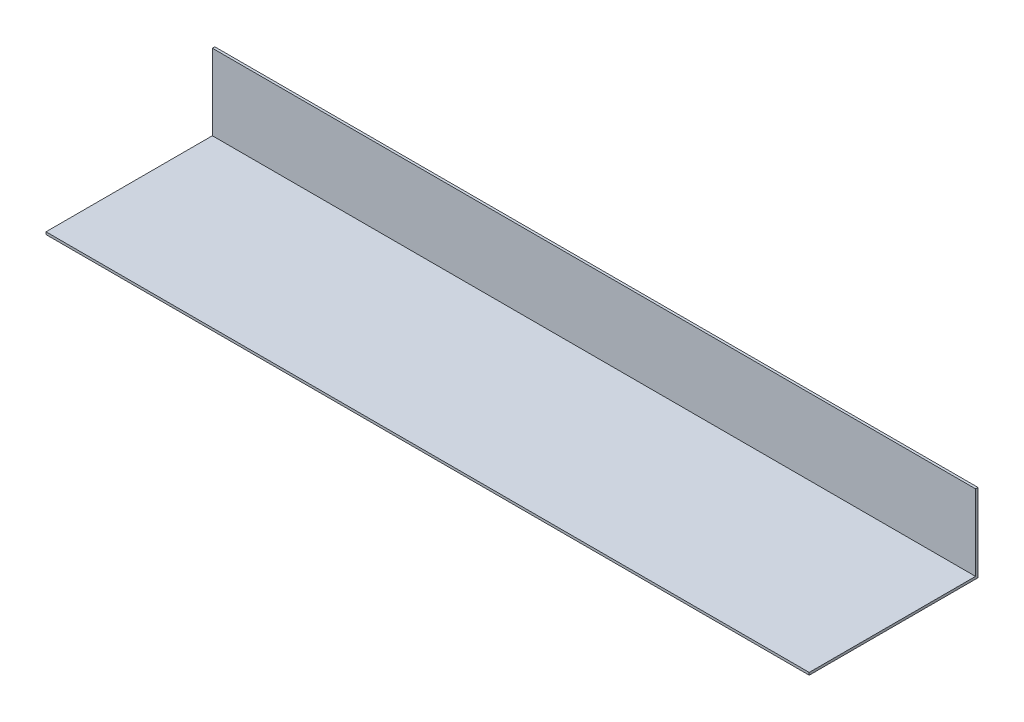
ISO-10303-21;
HEADER;
FILE_DESCRIPTION(('STEP AP214'),'2;1');
FILE_NAME('part.step','',(''),(''),'','','');
FILE_SCHEMA(('AUTOMOTIVE_DESIGN { 1 0 10303 214 1 1 1 1 }'));
ENDSEC;
DATA;
#1=APPLICATION_CONTEXT('core data for automotive mechanical design processes');
#2=APPLICATION_PROTOCOL_DEFINITION('international standard','automotive_design',2000,#1);
#3=PRODUCT_CONTEXT('',#1,'mechanical');
#4=PRODUCT('Part','Part','',(#3));
#5=PRODUCT_RELATED_PRODUCT_CATEGORY('part','',(#4));
#6=PRODUCT_DEFINITION_FORMATION('','',#4);
#7=PRODUCT_DEFINITION_CONTEXT('part definition',#1,'design');
#8=PRODUCT_DEFINITION('design','',#6,#7);
#9=PRODUCT_DEFINITION_SHAPE('','',#8);
#10=(LENGTH_UNIT() NAMED_UNIT(*) SI_UNIT(.MILLI.,.METRE.));
#11=(NAMED_UNIT(*) PLANE_ANGLE_UNIT() SI_UNIT($,.RADIAN.));
#12=(NAMED_UNIT(*) SI_UNIT($,.STERADIAN.) SOLID_ANGLE_UNIT());
#13=UNCERTAINTY_MEASURE_WITH_UNIT(LENGTH_MEASURE(1.E-05),#10,'distance_accuracy_value','');
#14=(GEOMETRIC_REPRESENTATION_CONTEXT(3) GLOBAL_UNCERTAINTY_ASSIGNED_CONTEXT((#13)) GLOBAL_UNIT_ASSIGNED_CONTEXT((#10,
#11,#12)) REPRESENTATION_CONTEXT('',''));
#15=CARTESIAN_POINT('',(0.,0.,0.));
#16=DIRECTION('',(0.,0.,1.));
#17=DIRECTION('',(1.,0.,0.));
#18=AXIS2_PLACEMENT_3D('',#15,#16,#17);
#19=CARTESIAN_POINT('',(0.,0.,1.5875));
#20=DIRECTION('',(0.,0.,-1.));
#21=DIRECTION('',(-1.,0.,0.));
#22=AXIS2_PLACEMENT_3D('',#19,#20,#21);
#23=PLANE('',#22);
#24=DIRECTION('',(-1.,0.,0.));
#25=VECTOR('',#24,1.);
#26=CARTESIAN_POINT('',(-247.65,-23.8125,1.5875));
#27=LINE('',#26,#25);
#28=CARTESIAN_POINT('',(247.65,-23.8125,1.5875));
#29=VERTEX_POINT('',#28);
#30=CARTESIAN_POINT('',(-247.65,-23.8125,1.5875));
#31=VERTEX_POINT('',#30);
#32=EDGE_CURVE('E55',#29,#31,#27,.T.);
#33=ORIENTED_EDGE('',*,*,#32,.F.);
#34=DIRECTION('',(0.,1.,0.));
#35=VECTOR('',#34,1.);
#36=CARTESIAN_POINT('',(247.65,-25.4,1.5875));
#37=LINE('',#36,#35);
#38=CARTESIAN_POINT('',(247.65,25.4,1.5875));
#39=VERTEX_POINT('',#38);
#40=EDGE_CURVE('E94',#29,#39,#37,.T.);
#41=ORIENTED_EDGE('',*,*,#40,.T.);
#42=DIRECTION('',(-1.,0.,0.));
#43=VECTOR('',#42,1.);
#44=CARTESIAN_POINT('',(-247.65,25.4,1.5875));
#45=LINE('',#44,#43);
#46=CARTESIAN_POINT('',(-247.65,25.4,1.5875));
#47=VERTEX_POINT('',#46);
#48=EDGE_CURVE('E61',#39,#47,#45,.T.);
#49=ORIENTED_EDGE('',*,*,#48,.T.);
#50=DIRECTION('',(0.,-1.,0.));
#51=VECTOR('',#50,1.);
#52=CARTESIAN_POINT('',(-247.65,-25.4,1.5875));
#53=LINE('',#52,#51);
#54=EDGE_CURVE('E106',#47,#31,#53,.T.);
#55=ORIENTED_EDGE('',*,*,#54,.T.);
#56=EDGE_LOOP('',(#33,#41,#49,#55));
#57=FACE_BOUND('',#56,.T.);
#58=ADVANCED_FACE('F39',(#57),#23,.F.);
#59=CARTESIAN_POINT('',(247.65,-25.4,1.5875));
#60=DIRECTION('',(-1.,0.,0.));
#61=DIRECTION('',(0.,0.,1.));
#62=AXIS2_PLACEMENT_3D('',#59,#60,#61);
#63=PLANE('',#62);
#64=DIRECTION('',(0.,1.,0.));
#65=VECTOR('',#64,1.);
#66=CARTESIAN_POINT('',(247.65,-25.4,0.));
#67=LINE('',#66,#65);
#68=CARTESIAN_POINT('',(247.65,-25.4,0.));
#69=VERTEX_POINT('',#68);
#70=CARTESIAN_POINT('',(247.65,25.4,0.));
#71=VERTEX_POINT('',#70);
#72=EDGE_CURVE('E101',#69,#71,#67,.T.);
#73=ORIENTED_EDGE('',*,*,#72,.T.);
#74=DIRECTION('',(0.,0.,-1.));
#75=VECTOR('',#74,1.);
#76=CARTESIAN_POINT('',(247.65,25.4,1.5875));
#77=LINE('',#76,#75);
#78=EDGE_CURVE('E11',#39,#71,#77,.T.);
#79=ORIENTED_EDGE('',*,*,#78,.F.);
#80=ORIENTED_EDGE('',*,*,#40,.F.);
#81=DIRECTION('',(0.,0.,-1.));
#82=VECTOR('',#81,1.);
#83=CARTESIAN_POINT('',(247.65,-23.8125,109.5375));
#84=LINE('',#83,#82);
#85=CARTESIAN_POINT('',(247.65,-23.8125,109.5375));
#86=VERTEX_POINT('',#85);
#87=EDGE_CURVE('E111',#86,#29,#84,.T.);
#88=ORIENTED_EDGE('',*,*,#87,.F.);
#89=DIRECTION('',(0.,1.,0.));
#90=VECTOR('',#89,1.);
#91=CARTESIAN_POINT('',(247.65,-25.4,109.5375));
#92=LINE('',#91,#90);
#93=CARTESIAN_POINT('',(247.65,-25.4,109.5375));
#94=VERTEX_POINT('',#93);
#95=EDGE_CURVE('E104',#94,#86,#92,.T.);
#96=ORIENTED_EDGE('',*,*,#95,.F.);
#97=DIRECTION('',(0.,0.,-1.));
#98=VECTOR('',#97,1.);
#99=CARTESIAN_POINT('',(247.65,-25.4,1.5875));
#100=LINE('',#99,#98);
#101=EDGE_CURVE('E86',#94,#69,#100,.T.);
#102=ORIENTED_EDGE('',*,*,#101,.T.);
#103=EDGE_LOOP('',(#73,#79,#80,#88,#96,#102));
#104=FACE_BOUND('',#103,.T.);
#105=ADVANCED_FACE('F41',(#104),#63,.F.);
#106=CARTESIAN_POINT('',(-247.65,25.4,1.5875));
#107=DIRECTION('',(0.,-1.,0.));
#108=DIRECTION('',(0.,0.,-1.));
#109=AXIS2_PLACEMENT_3D('',#106,#107,#108);
#110=PLANE('',#109);
#111=DIRECTION('',(-1.,0.,0.));
#112=VECTOR('',#111,1.);
#113=CARTESIAN_POINT('',(-247.65,25.4,0.));
#114=LINE('',#113,#112);
#115=CARTESIAN_POINT('',(-247.65,25.4,0.));
#116=VERTEX_POINT('',#115);
#117=EDGE_CURVE('E109',#71,#116,#114,.T.);
#118=ORIENTED_EDGE('',*,*,#117,.T.);
#119=DIRECTION('',(0.,0.,-1.));
#120=VECTOR('',#119,1.);
#121=CARTESIAN_POINT('',(-247.65,25.4,1.5875));
#122=LINE('',#121,#120);
#123=EDGE_CURVE('E48',#47,#116,#122,.T.);
#124=ORIENTED_EDGE('',*,*,#123,.F.);
#125=ORIENTED_EDGE('',*,*,#48,.F.);
#126=ORIENTED_EDGE('',*,*,#78,.T.);
#127=EDGE_LOOP('',(#118,#124,#125,#126));
#128=FACE_BOUND('',#127,.T.);
#129=ADVANCED_FACE('F132',(#128),#110,.F.);
#130=CARTESIAN_POINT('',(-247.65,-25.4,1.5875));
#131=DIRECTION('',(1.,0.,0.));
#132=DIRECTION('',(0.,0.,-1.));
#133=AXIS2_PLACEMENT_3D('',#130,#131,#132);
#134=PLANE('',#133);
#135=DIRECTION('',(0.,-1.,0.));
#136=VECTOR('',#135,1.);
#137=CARTESIAN_POINT('',(-247.65,-25.4,0.));
#138=LINE('',#137,#136);
#139=CARTESIAN_POINT('',(-247.65,-25.4,0.));
#140=VERTEX_POINT('',#139);
#141=EDGE_CURVE('E95',#116,#140,#138,.T.);
#142=ORIENTED_EDGE('',*,*,#141,.T.);
#143=DIRECTION('',(0.,0.,-1.));
#144=VECTOR('',#143,1.);
#145=CARTESIAN_POINT('',(-247.65,-25.4,1.5875));
#146=LINE('',#145,#144);
#147=CARTESIAN_POINT('',(-247.65,-25.4,109.5375));
#148=VERTEX_POINT('',#147);
#149=EDGE_CURVE('E89',#148,#140,#146,.T.);
#150=ORIENTED_EDGE('',*,*,#149,.F.);
#151=DIRECTION('',(0.,-1.,0.));
#152=VECTOR('',#151,1.);
#153=CARTESIAN_POINT('',(-247.65,-25.4,109.5375));
#154=LINE('',#153,#152);
#155=CARTESIAN_POINT('',(-247.65,-23.8125,109.5375));
#156=VERTEX_POINT('',#155);
#157=EDGE_CURVE('E157',#156,#148,#154,.T.);
#158=ORIENTED_EDGE('',*,*,#157,.F.);
#159=DIRECTION('',(0.,0.,-1.));
#160=VECTOR('',#159,1.);
#161=CARTESIAN_POINT('',(-247.65,-23.8125,109.5375));
#162=LINE('',#161,#160);
#163=EDGE_CURVE('E117',#156,#31,#162,.T.);
#164=ORIENTED_EDGE('',*,*,#163,.T.);
#165=ORIENTED_EDGE('',*,*,#54,.F.);
#166=ORIENTED_EDGE('',*,*,#123,.T.);
#167=EDGE_LOOP('',(#142,#150,#158,#164,#165,#166));
#168=FACE_BOUND('',#167,.T.);
#169=ADVANCED_FACE('F129',(#168),#134,.F.);
#170=CARTESIAN_POINT('',(-247.65,-25.4,1.5875));
#171=DIRECTION('',(0.,1.,0.));
#172=DIRECTION('',(0.,0.,1.));
#173=AXIS2_PLACEMENT_3D('',#170,#171,#172);
#174=PLANE('',#173);
#175=DIRECTION('',(1.,0.,0.));
#176=VECTOR('',#175,1.);
#177=CARTESIAN_POINT('',(-247.65,-25.4,0.));
#178=LINE('',#177,#176);
#179=EDGE_CURVE('E81',#140,#69,#178,.T.);
#180=ORIENTED_EDGE('',*,*,#179,.T.);
#181=ORIENTED_EDGE('',*,*,#101,.F.);
#182=DIRECTION('',(1.,0.,0.));
#183=VECTOR('',#182,1.);
#184=CARTESIAN_POINT('',(-247.65,-25.4,109.5375));
#185=LINE('',#184,#183);
#186=EDGE_CURVE('E152',#148,#94,#185,.T.);
#187=ORIENTED_EDGE('',*,*,#186,.F.);
#188=ORIENTED_EDGE('',*,*,#149,.T.);
#189=EDGE_LOOP('',(#180,#181,#187,#188));
#190=FACE_BOUND('',#189,.T.);
#191=ADVANCED_FACE('F83',(#190),#174,.F.);
#192=CARTESIAN_POINT('',(0.,0.,0.));
#193=DIRECTION('',(0.,0.,-1.));
#194=DIRECTION('',(-1.,0.,0.));
#195=AXIS2_PLACEMENT_3D('',#192,#193,#194);
#196=PLANE('',#195);
#197=ORIENTED_EDGE('',*,*,#72,.F.);
#198=ORIENTED_EDGE('',*,*,#179,.F.);
#199=ORIENTED_EDGE('',*,*,#141,.F.);
#200=ORIENTED_EDGE('',*,*,#117,.F.);
#201=EDGE_LOOP('',(#197,#198,#199,#200));
#202=FACE_BOUND('',#201,.T.);
#203=ADVANCED_FACE('F108',(#202),#196,.T.);
#204=CARTESIAN_POINT('',(-247.65,-23.8125,109.5375));
#205=DIRECTION('',(0.,-1.,0.));
#206=DIRECTION('',(0.,0.,-1.));
#207=AXIS2_PLACEMENT_3D('',#204,#205,#206);
#208=PLANE('',#207);
#209=ORIENTED_EDGE('',*,*,#32,.T.);
#210=ORIENTED_EDGE('',*,*,#163,.F.);
#211=DIRECTION('',(-1.,0.,0.));
#212=VECTOR('',#211,1.);
#213=CARTESIAN_POINT('',(-247.65,-23.8125,109.5375));
#214=LINE('',#213,#212);
#215=EDGE_CURVE('E142',#86,#156,#214,.T.);
#216=ORIENTED_EDGE('',*,*,#215,.F.);
#217=ORIENTED_EDGE('',*,*,#87,.T.);
#218=EDGE_LOOP('',(#209,#210,#216,#217));
#219=FACE_BOUND('',#218,.T.);
#220=ADVANCED_FACE('F138',(#219),#208,.F.);
#221=CARTESIAN_POINT('',(0.,0.,109.5375));
#222=DIRECTION('',(0.,0.,-1.));
#223=DIRECTION('',(-1.,0.,0.));
#224=AXIS2_PLACEMENT_3D('',#221,#222,#223);
#225=PLANE('',#224);
#226=ORIENTED_EDGE('',*,*,#157,.T.);
#227=ORIENTED_EDGE('',*,*,#186,.T.);
#228=ORIENTED_EDGE('',*,*,#95,.T.);
#229=ORIENTED_EDGE('',*,*,#215,.T.);
#230=EDGE_LOOP('',(#226,#227,#228,#229));
#231=FACE_BOUND('',#230,.T.);
#232=ADVANCED_FACE('F165',(#231),#225,.F.);
#233=CLOSED_SHELL('',(#58,#105,#129,#169,#191,#203,#220,#232));
#234=MANIFOLD_SOLID_BREP('B2',#233);
#235=ADVANCED_BREP_SHAPE_REPRESENTATION('',(#18,#234),#14);
#236=SHAPE_DEFINITION_REPRESENTATION(#9,#235);
ENDSEC;
END-ISO-10303-21;
